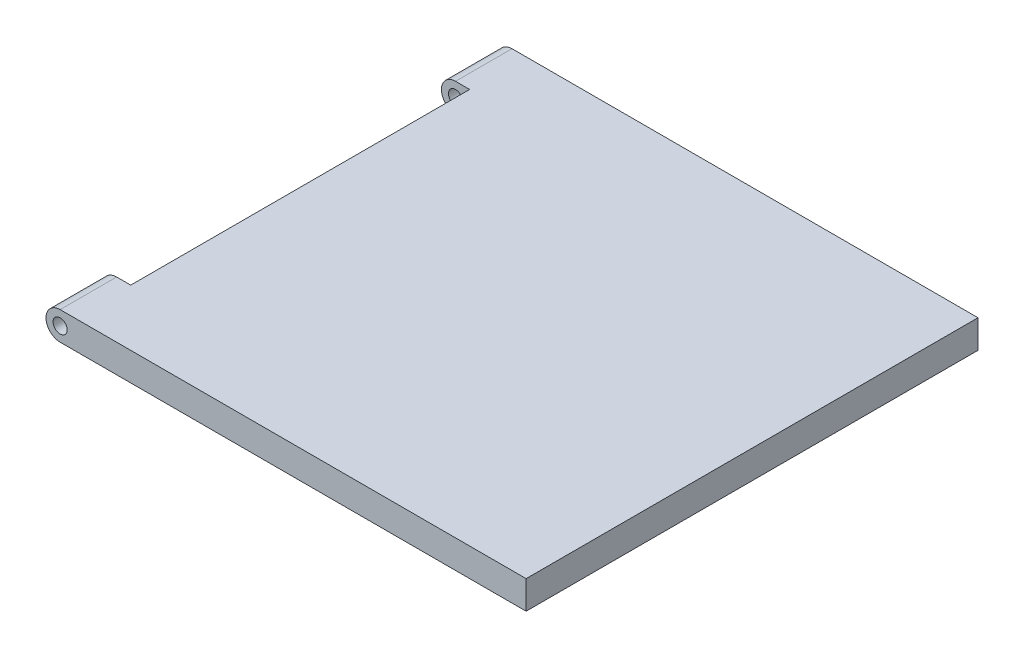
ISO-10303-21;
HEADER;
FILE_DESCRIPTION(('STEP AP214'),'2;1');
FILE_NAME('part.step','',(''),(''),'','','');
FILE_SCHEMA(('AUTOMOTIVE_DESIGN { 1 0 10303 214 1 1 1 1 }'));
ENDSEC;
DATA;
#1=APPLICATION_CONTEXT('core data for automotive mechanical design processes');
#2=APPLICATION_PROTOCOL_DEFINITION('international standard','automotive_design',2000,#1);
#3=PRODUCT_CONTEXT('',#1,'mechanical');
#4=PRODUCT('Part','Part','',(#3));
#5=PRODUCT_RELATED_PRODUCT_CATEGORY('part','',(#4));
#6=PRODUCT_DEFINITION_FORMATION('','',#4);
#7=PRODUCT_DEFINITION_CONTEXT('part definition',#1,'design');
#8=PRODUCT_DEFINITION('design','',#6,#7);
#9=PRODUCT_DEFINITION_SHAPE('','',#8);
#10=(LENGTH_UNIT() NAMED_UNIT(*) SI_UNIT(.MILLI.,.METRE.));
#11=(NAMED_UNIT(*) PLANE_ANGLE_UNIT() SI_UNIT($,.RADIAN.));
#12=(NAMED_UNIT(*) SI_UNIT($,.STERADIAN.) SOLID_ANGLE_UNIT());
#13=UNCERTAINTY_MEASURE_WITH_UNIT(LENGTH_MEASURE(1.E-05),#10,'distance_accuracy_value','');
#14=(GEOMETRIC_REPRESENTATION_CONTEXT(3) GLOBAL_UNCERTAINTY_ASSIGNED_CONTEXT((#13)) GLOBAL_UNIT_ASSIGNED_CONTEXT((#10,
#11,#12)) REPRESENTATION_CONTEXT('',''));
#15=CARTESIAN_POINT('',(0.,0.,0.));
#16=DIRECTION('',(0.,0.,1.));
#17=DIRECTION('',(1.,0.,0.));
#18=AXIS2_PLACEMENT_3D('',#15,#16,#17);
#19=CARTESIAN_POINT('',(0.,5.,40.));
#20=DIRECTION('',(1.,0.,0.));
#21=DIRECTION('',(0.,1.,0.));
#22=AXIS2_PLACEMENT_3D('',#19,#20,#21);
#23=PLANE('',#22);
#24=DIRECTION('',(0.,1.,0.));
#25=VECTOR('',#24,1.);
#26=CARTESIAN_POINT('',(0.,0.,-30.));
#27=LINE('',#26,#25);
#28=CARTESIAN_POINT('',(0.,0.,-30.));
#29=VERTEX_POINT('',#28);
#30=CARTESIAN_POINT('',(0.,5.,-30.));
#31=VERTEX_POINT('',#30);
#32=EDGE_CURVE('E62',#29,#31,#27,.T.);
#33=ORIENTED_EDGE('',*,*,#32,.F.);
#34=DIRECTION('',(0.,0.,-1.));
#35=VECTOR('',#34,1.);
#36=CARTESIAN_POINT('',(0.,0.,40.));
#37=LINE('',#36,#35);
#38=CARTESIAN_POINT('',(0.,0.,30.));
#39=VERTEX_POINT('',#38);
#40=EDGE_CURVE('E11',#39,#29,#37,.T.);
#41=ORIENTED_EDGE('',*,*,#40,.F.);
#42=DIRECTION('',(0.,1.,0.));
#43=VECTOR('',#42,1.);
#44=CARTESIAN_POINT('',(0.,0.,30.));
#45=LINE('',#44,#43);
#46=CARTESIAN_POINT('',(0.,5.,30.));
#47=VERTEX_POINT('',#46);
#48=EDGE_CURVE('E189',#39,#47,#45,.T.);
#49=ORIENTED_EDGE('',*,*,#48,.T.);
#50=DIRECTION('',(0.,0.,-1.));
#51=VECTOR('',#50,1.);
#52=CARTESIAN_POINT('',(0.,5.,40.));
#53=LINE('',#52,#51);
#54=EDGE_CURVE('E116',#47,#31,#53,.T.);
#55=ORIENTED_EDGE('',*,*,#54,.T.);
#56=EDGE_LOOP('',(#33,#41,#49,#55));
#57=FACE_BOUND('',#56,.T.);
#58=ADVANCED_FACE('F39',(#57),#23,.F.);
#59=CARTESIAN_POINT('',(0.,0.,40.));
#60=DIRECTION('',(0.,1.,0.));
#61=DIRECTION('',(0.,0.,1.));
#62=AXIS2_PLACEMENT_3D('',#59,#60,#61);
#63=PLANE('',#62);
#64=DIRECTION('',(1.,0.,0.));
#65=VECTOR('',#64,1.);
#66=CARTESIAN_POINT('',(0.,0.,-40.));
#67=LINE('',#66,#65);
#68=CARTESIAN_POINT('',(-2.5,0.,-40.));
#69=VERTEX_POINT('',#68);
#70=CARTESIAN_POINT('',(80.,0.,-40.));
#71=VERTEX_POINT('',#70);
#72=EDGE_CURVE('E137',#69,#71,#67,.T.);
#73=ORIENTED_EDGE('',*,*,#72,.T.);
#74=DIRECTION('',(0.,0.,-1.));
#75=VECTOR('',#74,1.);
#76=CARTESIAN_POINT('',(80.,0.,40.));
#77=LINE('',#76,#75);
#78=CARTESIAN_POINT('',(80.,0.,40.));
#79=VERTEX_POINT('',#78);
#80=EDGE_CURVE('E47',#79,#71,#77,.T.);
#81=ORIENTED_EDGE('',*,*,#80,.F.);
#82=DIRECTION('',(1.,0.,0.));
#83=VECTOR('',#82,1.);
#84=CARTESIAN_POINT('',(0.,0.,40.));
#85=LINE('',#84,#83);
#86=CARTESIAN_POINT('',(-2.5,0.,40.));
#87=VERTEX_POINT('',#86);
#88=EDGE_CURVE('E129',#87,#79,#85,.T.);
#89=ORIENTED_EDGE('',*,*,#88,.F.);
#90=DIRECTION('',(0.,0.,-1.));
#91=VECTOR('',#90,1.);
#92=CARTESIAN_POINT('',(-2.5,0.,40.));
#93=LINE('',#92,#91);
#94=CARTESIAN_POINT('',(-2.5,0.,30.));
#95=VERTEX_POINT('',#94);
#96=EDGE_CURVE('E196',#87,#95,#93,.T.);
#97=ORIENTED_EDGE('',*,*,#96,.T.);
#98=DIRECTION('',(1.,0.,0.));
#99=VECTOR('',#98,1.);
#100=CARTESIAN_POINT('',(-2.5,0.,30.));
#101=LINE('',#100,#99);
#102=EDGE_CURVE('E197',#95,#39,#101,.T.);
#103=ORIENTED_EDGE('',*,*,#102,.T.);
#104=ORIENTED_EDGE('',*,*,#40,.T.);
#105=DIRECTION('',(1.,0.,0.));
#106=VECTOR('',#105,1.);
#107=CARTESIAN_POINT('',(-2.5,0.,-30.));
#108=LINE('',#107,#106);
#109=CARTESIAN_POINT('',(-2.5,0.,-30.));
#110=VERTEX_POINT('',#109);
#111=EDGE_CURVE('E156',#110,#29,#108,.T.);
#112=ORIENTED_EDGE('',*,*,#111,.F.);
#113=DIRECTION('',(0.,0.,1.));
#114=VECTOR('',#113,1.);
#115=CARTESIAN_POINT('',(-2.5,0.,-40.));
#116=LINE('',#115,#114);
#117=EDGE_CURVE('E153',#69,#110,#116,.T.);
#118=ORIENTED_EDGE('',*,*,#117,.F.);
#119=EDGE_LOOP('',(#73,#81,#89,#97,#103,#104,#112,#118));
#120=FACE_BOUND('',#119,.T.);
#121=ADVANCED_FACE('F154',(#120),#63,.F.);
#122=CARTESIAN_POINT('',(80.,0.,40.));
#123=DIRECTION('',(-1.,0.,0.));
#124=DIRECTION('',(0.,0.,1.));
#125=AXIS2_PLACEMENT_3D('',#122,#123,#124);
#126=PLANE('',#125);
#127=DIRECTION('',(0.,1.,0.));
#128=VECTOR('',#127,1.);
#129=CARTESIAN_POINT('',(80.,0.,-40.));
#130=LINE('',#129,#128);
#131=CARTESIAN_POINT('',(80.,5.,-40.));
#132=VERTEX_POINT('',#131);
#133=EDGE_CURVE('E123',#71,#132,#130,.T.);
#134=ORIENTED_EDGE('',*,*,#133,.T.);
#135=DIRECTION('',(0.,0.,1.));
#136=VECTOR('',#135,1.);
#137=CARTESIAN_POINT('',(80.,5.,-40.));
#138=LINE('',#137,#136);
#139=CARTESIAN_POINT('',(80.,5.,40.));
#140=VERTEX_POINT('',#139);
#141=EDGE_CURVE('E107',#132,#140,#138,.T.);
#142=ORIENTED_EDGE('',*,*,#141,.T.);
#143=DIRECTION('',(0.,1.,0.));
#144=VECTOR('',#143,1.);
#145=CARTESIAN_POINT('',(80.,0.,40.));
#146=LINE('',#145,#144);
#147=EDGE_CURVE('E117',#79,#140,#146,.T.);
#148=ORIENTED_EDGE('',*,*,#147,.F.);
#149=ORIENTED_EDGE('',*,*,#80,.T.);
#150=EDGE_LOOP('',(#134,#142,#148,#149));
#151=FACE_BOUND('',#150,.T.);
#152=ADVANCED_FACE('F121',(#151),#126,.F.);
#153=CARTESIAN_POINT('',(75.,5.00000000000001,40.));
#154=DIRECTION('',(0.,-1.,0.));
#155=DIRECTION('',(1.,0.,0.));
#156=AXIS2_PLACEMENT_3D('',#153,#154,#155);
#157=PLANE('',#156);
#158=DIRECTION('',(-1.,0.,0.));
#159=VECTOR('',#158,1.);
#160=CARTESIAN_POINT('',(75.,5.00000000000001,-40.));
#161=LINE('',#160,#159);
#162=CARTESIAN_POINT('',(-2.5,5.,-40.));
#163=VERTEX_POINT('',#162);
#164=EDGE_CURVE('E54',#132,#163,#161,.T.);
#165=ORIENTED_EDGE('',*,*,#164,.T.);
#166=DIRECTION('',(0.,0.,1.));
#167=VECTOR('',#166,1.);
#168=CARTESIAN_POINT('',(-2.5,5.,-40.));
#169=LINE('',#168,#167);
#170=CARTESIAN_POINT('',(-2.5,5.,-30.));
#171=VERTEX_POINT('',#170);
#172=EDGE_CURVE('E162',#163,#171,#169,.T.);
#173=ORIENTED_EDGE('',*,*,#172,.T.);
#174=DIRECTION('',(-1.,0.,0.));
#175=VECTOR('',#174,1.);
#176=CARTESIAN_POINT('',(0.,5.,-30.));
#177=LINE('',#176,#175);
#178=EDGE_CURVE('E167',#31,#171,#177,.T.);
#179=ORIENTED_EDGE('',*,*,#178,.F.);
#180=ORIENTED_EDGE('',*,*,#54,.F.);
#181=DIRECTION('',(-1.,0.,0.));
#182=VECTOR('',#181,1.);
#183=CARTESIAN_POINT('',(0.,5.,30.));
#184=LINE('',#183,#182);
#185=CARTESIAN_POINT('',(-2.5,5.,30.));
#186=VERTEX_POINT('',#185);
#187=EDGE_CURVE('E201',#47,#186,#184,.T.);
#188=ORIENTED_EDGE('',*,*,#187,.T.);
#189=DIRECTION('',(0.,0.,-1.));
#190=VECTOR('',#189,1.);
#191=CARTESIAN_POINT('',(-2.5,5.,40.));
#192=LINE('',#191,#190);
#193=CARTESIAN_POINT('',(-2.5,5.,40.));
#194=VERTEX_POINT('',#193);
#195=EDGE_CURVE('E110',#194,#186,#192,.T.);
#196=ORIENTED_EDGE('',*,*,#195,.F.);
#197=DIRECTION('',(-1.,0.,0.));
#198=VECTOR('',#197,1.);
#199=CARTESIAN_POINT('',(75.,5.00000000000001,40.));
#200=LINE('',#199,#198);
#201=EDGE_CURVE('E104',#140,#194,#200,.T.);
#202=ORIENTED_EDGE('',*,*,#201,.F.);
#203=ORIENTED_EDGE('',*,*,#141,.F.);
#204=EDGE_LOOP('',(#165,#173,#179,#180,#188,#196,#202,#203));
#205=FACE_BOUND('',#204,.T.);
#206=ADVANCED_FACE('F106',(#205),#157,.F.);
#207=CARTESIAN_POINT('',(0.,0.,40.));
#208=DIRECTION('',(0.,0.,1.));
#209=DIRECTION('',(1.,0.,0.));
#210=AXIS2_PLACEMENT_3D('',#207,#208,#209);
#211=PLANE('',#210);
#212=ORIENTED_EDGE('',*,*,#147,.T.);
#213=ORIENTED_EDGE('',*,*,#201,.T.);
#214=CARTESIAN_POINT('',(-2.5,2.5,40.));
#215=DIRECTION('',(0.,0.,1.));
#216=DIRECTION('',(1.,0.,0.));
#217=AXIS2_PLACEMENT_3D('',#214,#215,#216);
#218=CIRCLE('',#217,2.5);
#219=EDGE_CURVE('E193',#194,#87,#218,.T.);
#220=ORIENTED_EDGE('',*,*,#219,.T.);
#221=ORIENTED_EDGE('',*,*,#88,.T.);
#222=EDGE_LOOP('',(#212,#213,#220,#221));
#223=FACE_BOUND('',#222,.T.);
#224=CARTESIAN_POINT('',(-2.5,2.5,40.));
#225=DIRECTION('',(0.,0.,1.));
#226=DIRECTION('',(1.,0.,0.));
#227=AXIS2_PLACEMENT_3D('',#224,#225,#226);
#228=CIRCLE('',#227,1.25);
#229=CARTESIAN_POINT('',(-1.25,2.5,40.));
#230=VERTEX_POINT('',#229);
#231=EDGE_CURVE('E185',#230,#230,#228,.T.);
#232=ORIENTED_EDGE('',*,*,#231,.F.);
#233=EDGE_LOOP('',(#232));
#234=FACE_BOUND('',#233,.T.);
#235=ADVANCED_FACE('F127',(#223,#234),#211,.T.);
#236=CARTESIAN_POINT('',(0.,0.,-40.));
#237=DIRECTION('',(0.,0.,1.));
#238=DIRECTION('',(1.,0.,0.));
#239=AXIS2_PLACEMENT_3D('',#236,#237,#238);
#240=PLANE('',#239);
#241=ORIENTED_EDGE('',*,*,#164,.F.);
#242=ORIENTED_EDGE('',*,*,#133,.F.);
#243=ORIENTED_EDGE('',*,*,#72,.F.);
#244=CARTESIAN_POINT('',(-2.5,2.5,-40.));
#245=DIRECTION('',(0.,0.,1.));
#246=DIRECTION('',(1.,0.,0.));
#247=AXIS2_PLACEMENT_3D('',#244,#245,#246);
#248=CIRCLE('',#247,2.5);
#249=EDGE_CURVE('E151',#163,#69,#248,.T.);
#250=ORIENTED_EDGE('',*,*,#249,.F.);
#251=EDGE_LOOP('',(#241,#242,#243,#250));
#252=FACE_BOUND('',#251,.T.);
#253=CARTESIAN_POINT('',(-2.5,2.5,-40.));
#254=DIRECTION('',(0.,0.,1.));
#255=DIRECTION('',(1.,0.,0.));
#256=AXIS2_PLACEMENT_3D('',#253,#254,#255);
#257=CIRCLE('',#256,1.25);
#258=CARTESIAN_POINT('',(-1.25,2.5,-40.));
#259=VERTEX_POINT('',#258);
#260=EDGE_CURVE('E180',#259,#259,#257,.T.);
#261=ORIENTED_EDGE('',*,*,#260,.T.);
#262=EDGE_LOOP('',(#261));
#263=FACE_BOUND('',#262,.T.);
#264=ADVANCED_FACE('F147',(#252,#263),#240,.F.);
#265=CARTESIAN_POINT('',(-2.5,2.5,30.));
#266=DIRECTION('',(0.,0.,1.));
#267=DIRECTION('',(1.,0.,0.));
#268=AXIS2_PLACEMENT_3D('',#265,#266,#267);
#269=PLANE('',#268);
#270=ORIENTED_EDGE('',*,*,#48,.F.);
#271=ORIENTED_EDGE('',*,*,#102,.F.);
#272=CARTESIAN_POINT('',(-2.5,2.5,30.));
#273=DIRECTION('',(0.,0.,1.));
#274=DIRECTION('',(1.,0.,0.));
#275=AXIS2_PLACEMENT_3D('',#272,#273,#274);
#276=CIRCLE('',#275,2.5);
#277=EDGE_CURVE('E204',#186,#95,#276,.T.);
#278=ORIENTED_EDGE('',*,*,#277,.F.);
#279=ORIENTED_EDGE('',*,*,#187,.F.);
#280=EDGE_LOOP('',(#270,#271,#278,#279));
#281=FACE_BOUND('',#280,.T.);
#282=CARTESIAN_POINT('',(-2.5,2.5,30.));
#283=DIRECTION('',(0.,0.,1.));
#284=DIRECTION('',(1.,0.,0.));
#285=AXIS2_PLACEMENT_3D('',#282,#283,#284);
#286=CIRCLE('',#285,1.25);
#287=CARTESIAN_POINT('',(-1.25,2.5,30.));
#288=VERTEX_POINT('',#287);
#289=EDGE_CURVE('E161',#288,#288,#286,.T.);
#290=ORIENTED_EDGE('',*,*,#289,.T.);
#291=EDGE_LOOP('',(#290));
#292=FACE_BOUND('',#291,.T.);
#293=ADVANCED_FACE('F219',(#281,#292),#269,.F.);
#294=CARTESIAN_POINT('',(-2.5,2.5,40.));
#295=DIRECTION('',(0.,0.,-1.));
#296=DIRECTION('',(-1.,0.,0.));
#297=AXIS2_PLACEMENT_3D('',#294,#295,#296);
#298=CYLINDRICAL_SURFACE('',#297,2.5);
#299=ORIENTED_EDGE('',*,*,#277,.T.);
#300=ORIENTED_EDGE('',*,*,#96,.F.);
#301=ORIENTED_EDGE('',*,*,#219,.F.);
#302=ORIENTED_EDGE('',*,*,#195,.T.);
#303=EDGE_LOOP('',(#299,#300,#301,#302));
#304=FACE_BOUND('',#303,.T.);
#305=ADVANCED_FACE('F214',(#304),#298,.T.);
#306=CARTESIAN_POINT('',(-2.5,2.5,40.));
#307=DIRECTION('',(0.,0.,-1.));
#308=DIRECTION('',(-1.,0.,0.));
#309=AXIS2_PLACEMENT_3D('',#306,#307,#308);
#310=CYLINDRICAL_SURFACE('',#309,1.25);
#311=ORIENTED_EDGE('',*,*,#231,.T.);
#312=EDGE_LOOP('',(#311));
#313=FACE_BOUND('',#312,.T.);
#314=ORIENTED_EDGE('',*,*,#289,.F.);
#315=EDGE_LOOP('',(#314));
#316=FACE_BOUND('',#315,.T.);
#317=ADVANCED_FACE('F242',(#313,#316),#310,.F.);
#318=CARTESIAN_POINT('',(-2.5,2.5,-40.));
#319=DIRECTION('',(0.,0.,1.));
#320=DIRECTION('',(1.,0.,0.));
#321=AXIS2_PLACEMENT_3D('',#318,#319,#320);
#322=CYLINDRICAL_SURFACE('',#321,2.5);
#323=CARTESIAN_POINT('',(-2.5,2.5,-30.));
#324=DIRECTION('',(0.,0.,1.));
#325=DIRECTION('',(1.,0.,0.));
#326=AXIS2_PLACEMENT_3D('',#323,#324,#325);
#327=CIRCLE('',#326,2.5);
#328=EDGE_CURVE('E173',#171,#110,#327,.T.);
#329=ORIENTED_EDGE('',*,*,#328,.F.);
#330=ORIENTED_EDGE('',*,*,#172,.F.);
#331=ORIENTED_EDGE('',*,*,#249,.T.);
#332=ORIENTED_EDGE('',*,*,#117,.T.);
#333=EDGE_LOOP('',(#329,#330,#331,#332));
#334=FACE_BOUND('',#333,.T.);
#335=ADVANCED_FACE('F165',(#334),#322,.T.);
#336=CARTESIAN_POINT('',(-2.5,2.5,-30.));
#337=DIRECTION('',(0.,0.,-1.));
#338=DIRECTION('',(1.,0.,0.));
#339=AXIS2_PLACEMENT_3D('',#336,#337,#338);
#340=PLANE('',#339);
#341=CARTESIAN_POINT('',(-2.5,2.5,-30.));
#342=DIRECTION('',(0.,0.,1.));
#343=DIRECTION('',(1.,0.,0.));
#344=AXIS2_PLACEMENT_3D('',#341,#342,#343);
#345=CIRCLE('',#344,1.25);
#346=CARTESIAN_POINT('',(-1.25,2.5,-30.));
#347=VERTEX_POINT('',#346);
#348=EDGE_CURVE('E125',#347,#347,#345,.T.);
#349=ORIENTED_EDGE('',*,*,#348,.F.);
#350=EDGE_LOOP('',(#349));
#351=FACE_BOUND('',#350,.T.);
#352=ORIENTED_EDGE('',*,*,#32,.T.);
#353=ORIENTED_EDGE('',*,*,#178,.T.);
#354=ORIENTED_EDGE('',*,*,#328,.T.);
#355=ORIENTED_EDGE('',*,*,#111,.T.);
#356=EDGE_LOOP('',(#352,#353,#354,#355));
#357=FACE_BOUND('',#356,.T.);
#358=ADVANCED_FACE('F222',(#351,#357),#340,.F.);
#359=CARTESIAN_POINT('',(-2.5,2.5,-40.));
#360=DIRECTION('',(0.,0.,1.));
#361=DIRECTION('',(1.,0.,0.));
#362=AXIS2_PLACEMENT_3D('',#359,#360,#361);
#363=CYLINDRICAL_SURFACE('',#362,1.25);
#364=ORIENTED_EDGE('',*,*,#260,.F.);
#365=EDGE_LOOP('',(#364));
#366=FACE_BOUND('',#365,.T.);
#367=ORIENTED_EDGE('',*,*,#348,.T.);
#368=EDGE_LOOP('',(#367));
#369=FACE_BOUND('',#368,.T.);
#370=ADVANCED_FACE('F252',(#366,#369),#363,.F.);
#371=CLOSED_SHELL('',(#58,#121,#152,#206,#235,#264,#293,#305,#317,#335,#358,#370));
#372=MANIFOLD_SOLID_BREP('B2',#371);
#373=ADVANCED_BREP_SHAPE_REPRESENTATION('',(#18,#372),#14);
#374=SHAPE_DEFINITION_REPRESENTATION(#9,#373);
ENDSEC;
END-ISO-10303-21;
